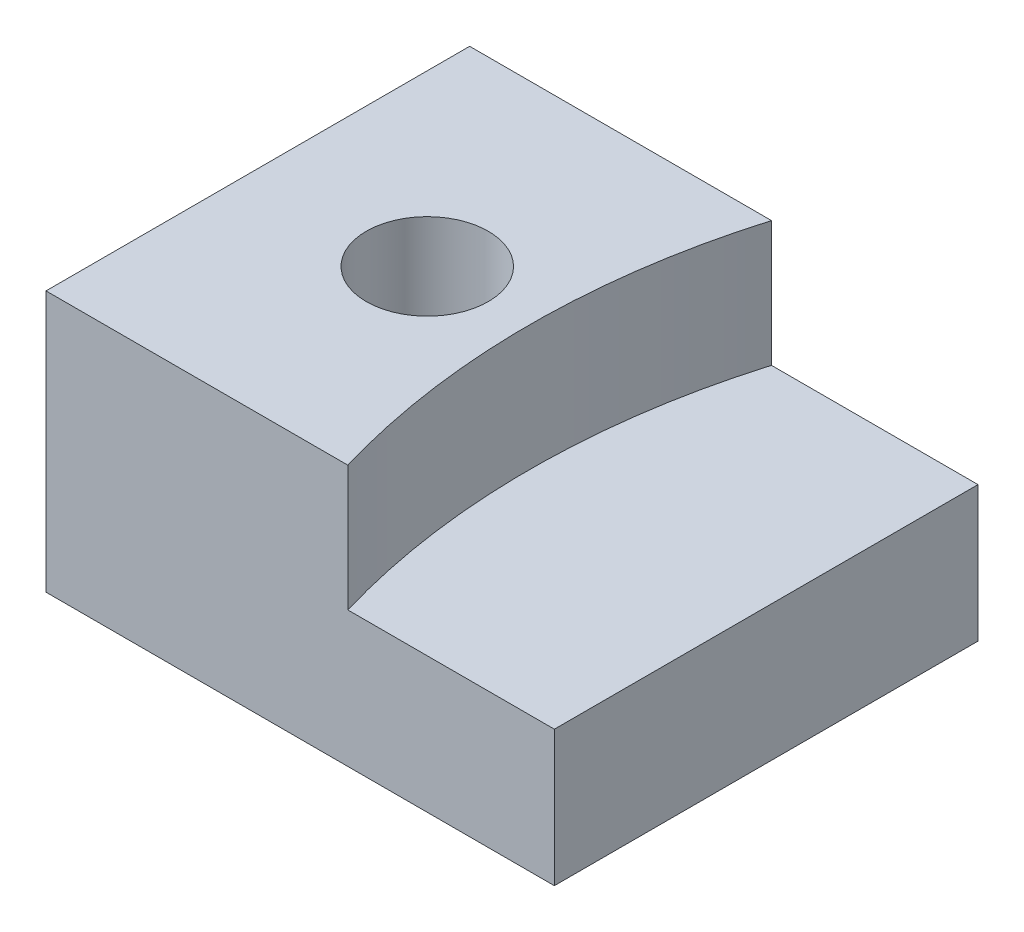
ISO-10303-21;
HEADER;
FILE_DESCRIPTION(('STEP AP214'),'2;1');
FILE_NAME('part.step','',(''),(''),'','','');
FILE_SCHEMA(('AUTOMOTIVE_DESIGN { 1 0 10303 214 1 1 1 1 }'));
ENDSEC;
DATA;
#1=APPLICATION_CONTEXT('core data for automotive mechanical design processes');
#2=APPLICATION_PROTOCOL_DEFINITION('international standard','automotive_design',2000,#1);
#3=PRODUCT_CONTEXT('',#1,'mechanical');
#4=PRODUCT('Part','Part','',(#3));
#5=PRODUCT_RELATED_PRODUCT_CATEGORY('part','',(#4));
#6=PRODUCT_DEFINITION_FORMATION('','',#4);
#7=PRODUCT_DEFINITION_CONTEXT('part definition',#1,'design');
#8=PRODUCT_DEFINITION('design','',#6,#7);
#9=PRODUCT_DEFINITION_SHAPE('','',#8);
#10=(LENGTH_UNIT() NAMED_UNIT(*) SI_UNIT(.MILLI.,.METRE.));
#11=(NAMED_UNIT(*) PLANE_ANGLE_UNIT() SI_UNIT($,.RADIAN.));
#12=(NAMED_UNIT(*) SI_UNIT($,.STERADIAN.) SOLID_ANGLE_UNIT());
#13=UNCERTAINTY_MEASURE_WITH_UNIT(LENGTH_MEASURE(1.E-05),#10,'distance_accuracy_value','');
#14=(GEOMETRIC_REPRESENTATION_CONTEXT(3) GLOBAL_UNCERTAINTY_ASSIGNED_CONTEXT((#13)) GLOBAL_UNIT_ASSIGNED_CONTEXT((#10,
#11,#12)) REPRESENTATION_CONTEXT('',''));
#15=CARTESIAN_POINT('',(0.,0.,0.));
#16=DIRECTION('',(0.,0.,1.));
#17=DIRECTION('',(1.,0.,0.));
#18=AXIS2_PLACEMENT_3D('',#15,#16,#17);
#19=CARTESIAN_POINT('',(0.,2.,0.));
#20=DIRECTION('',(0.,-1.,0.));
#21=DIRECTION('',(0.,0.,-1.));
#22=AXIS2_PLACEMENT_3D('',#19,#20,#21);
#23=PLANE('',#22);
#24=CARTESIAN_POINT('',(12.5,2.,0.));
#25=DIRECTION('',(0.,-1.,0.));
#26=DIRECTION('',(0.,0.,-1.));
#27=AXIS2_PLACEMENT_3D('',#24,#25,#26);
#28=CIRCLE('',#27,11.);
#29=CARTESIAN_POINT('',(1.95322916718108,2.,3.125));
#30=VERTEX_POINT('',#29);
#31=CARTESIAN_POINT('',(1.95322916718107,2.,-3.12499999999999));
#32=VERTEX_POINT('',#31);
#33=EDGE_CURVE('E49',#30,#32,#28,.T.);
#34=ORIENTED_EDGE('',*,*,#33,.F.);
#35=DIRECTION('',(1.,0.,0.));
#36=VECTOR('',#35,1.);
#37=CARTESIAN_POINT('',(-2.5,2.,3.125));
#38=LINE('',#37,#36);
#39=CARTESIAN_POINT('',(5.,2.,3.125));
#40=VERTEX_POINT('',#39);
#41=EDGE_CURVE('E87',#30,#40,#38,.T.);
#42=ORIENTED_EDGE('',*,*,#41,.T.);
#43=DIRECTION('',(0.,0.,-1.));
#44=VECTOR('',#43,1.);
#45=CARTESIAN_POINT('',(5.,2.,3.125));
#46=LINE('',#45,#44);
#47=CARTESIAN_POINT('',(5.,2.,-3.125));
#48=VERTEX_POINT('',#47);
#49=EDGE_CURVE('E55',#40,#48,#46,.T.);
#50=ORIENTED_EDGE('',*,*,#49,.T.);
#51=DIRECTION('',(-1.,0.,0.));
#52=VECTOR('',#51,1.);
#53=CARTESIAN_POINT('',(-2.5,2.,-3.125));
#54=LINE('',#53,#52);
#55=EDGE_CURVE('E97',#48,#32,#54,.T.);
#56=ORIENTED_EDGE('',*,*,#55,.T.);
#57=EDGE_LOOP('',(#34,#42,#50,#56));
#58=FACE_BOUND('',#57,.T.);
#59=ADVANCED_FACE('F34',(#58),#23,.F.);
#60=CARTESIAN_POINT('',(0.,0.,0.));
#61=DIRECTION('',(0.,-1.,0.));
#62=DIRECTION('',(0.,0.,-1.));
#63=AXIS2_PLACEMENT_3D('',#60,#61,#62);
#64=PLANE('',#63);
#65=DIRECTION('',(0.,0.,1.));
#66=VECTOR('',#65,1.);
#67=CARTESIAN_POINT('',(-2.5,0.,3.125));
#68=LINE('',#67,#66);
#69=CARTESIAN_POINT('',(-2.5,0.,-3.125));
#70=VERTEX_POINT('',#69);
#71=CARTESIAN_POINT('',(-2.5,0.,3.125));
#72=VERTEX_POINT('',#71);
#73=EDGE_CURVE('E93',#70,#72,#68,.T.);
#74=ORIENTED_EDGE('',*,*,#73,.F.);
#75=DIRECTION('',(-1.,0.,0.));
#76=VECTOR('',#75,1.);
#77=CARTESIAN_POINT('',(-2.5,0.,-3.125));
#78=LINE('',#77,#76);
#79=CARTESIAN_POINT('',(5.,0.,-3.125));
#80=VERTEX_POINT('',#79);
#81=EDGE_CURVE('E75',#80,#70,#78,.T.);
#82=ORIENTED_EDGE('',*,*,#81,.F.);
#83=DIRECTION('',(0.,0.,-1.));
#84=VECTOR('',#83,1.);
#85=CARTESIAN_POINT('',(5.,0.,3.125));
#86=LINE('',#85,#84);
#87=CARTESIAN_POINT('',(5.,0.,3.125));
#88=VERTEX_POINT('',#87);
#89=EDGE_CURVE('E88',#88,#80,#86,.T.);
#90=ORIENTED_EDGE('',*,*,#89,.F.);
#91=DIRECTION('',(1.,0.,0.));
#92=VECTOR('',#91,1.);
#93=CARTESIAN_POINT('',(-2.5,0.,3.125));
#94=LINE('',#93,#92);
#95=EDGE_CURVE('E101',#72,#88,#94,.T.);
#96=ORIENTED_EDGE('',*,*,#95,.F.);
#97=EDGE_LOOP('',(#74,#82,#90,#96));
#98=FACE_BOUND('',#97,.T.);
#99=CARTESIAN_POINT('',(0.,0.,0.));
#100=DIRECTION('',(0.,1.,0.));
#101=DIRECTION('',(0.,0.,1.));
#102=AXIS2_PLACEMENT_3D('',#99,#100,#101);
#103=CIRCLE('',#102,0.9);
#104=CARTESIAN_POINT('',(0.,0.,0.9));
#105=VERTEX_POINT('',#104);
#106=EDGE_CURVE('E102',#105,#105,#103,.T.);
#107=ORIENTED_EDGE('',*,*,#106,.T.);
#108=EDGE_LOOP('',(#107));
#109=FACE_BOUND('',#108,.T.);
#110=ADVANCED_FACE('F99',(#98,#109),#64,.T.);
#111=CARTESIAN_POINT('',(-2.5,2.,3.125));
#112=DIRECTION('',(1.,0.,0.));
#113=DIRECTION('',(0.,0.,-1.));
#114=AXIS2_PLACEMENT_3D('',#111,#112,#113);
#115=PLANE('',#114);
#116=ORIENTED_EDGE('',*,*,#73,.T.);
#117=DIRECTION('',(0.,-1.,0.));
#118=VECTOR('',#117,1.);
#119=CARTESIAN_POINT('',(-2.5,2.,3.125));
#120=LINE('',#119,#118);
#121=CARTESIAN_POINT('',(-2.5,3.85,3.125));
#122=VERTEX_POINT('',#121);
#123=EDGE_CURVE('E11',#122,#72,#120,.T.);
#124=ORIENTED_EDGE('',*,*,#123,.F.);
#125=DIRECTION('',(0.,0.,1.));
#126=VECTOR('',#125,1.);
#127=CARTESIAN_POINT('',(-2.5,3.85,-3.125));
#128=LINE('',#127,#126);
#129=CARTESIAN_POINT('',(-2.5,3.85,-3.125));
#130=VERTEX_POINT('',#129);
#131=EDGE_CURVE('E95',#130,#122,#128,.T.);
#132=ORIENTED_EDGE('',*,*,#131,.F.);
#133=DIRECTION('',(0.,-1.,0.));
#134=VECTOR('',#133,1.);
#135=CARTESIAN_POINT('',(-2.5,2.,-3.125));
#136=LINE('',#135,#134);
#137=EDGE_CURVE('E80',#130,#70,#136,.T.);
#138=ORIENTED_EDGE('',*,*,#137,.T.);
#139=EDGE_LOOP('',(#116,#124,#132,#138));
#140=FACE_BOUND('',#139,.T.);
#141=ADVANCED_FACE('F36',(#140),#115,.F.);
#142=CARTESIAN_POINT('',(-2.5,2.,3.125));
#143=DIRECTION('',(0.,0.,-1.));
#144=DIRECTION('',(-1.,0.,0.));
#145=AXIS2_PLACEMENT_3D('',#142,#143,#144);
#146=PLANE('',#145);
#147=ORIENTED_EDGE('',*,*,#95,.T.);
#148=DIRECTION('',(0.,-1.,0.));
#149=VECTOR('',#148,1.);
#150=CARTESIAN_POINT('',(5.,2.,3.125));
#151=LINE('',#150,#149);
#152=EDGE_CURVE('E42',#40,#88,#151,.T.);
#153=ORIENTED_EDGE('',*,*,#152,.F.);
#154=ORIENTED_EDGE('',*,*,#41,.F.);
#155=DIRECTION('',(0.,-1.,0.));
#156=VECTOR('',#155,1.);
#157=CARTESIAN_POINT('',(1.95322916718108,3.85,3.125));
#158=LINE('',#157,#156);
#159=CARTESIAN_POINT('',(1.95322916718108,3.85,3.125));
#160=VERTEX_POINT('',#159);
#161=EDGE_CURVE('E106',#160,#30,#158,.T.);
#162=ORIENTED_EDGE('',*,*,#161,.F.);
#163=DIRECTION('',(1.,0.,0.));
#164=VECTOR('',#163,1.);
#165=CARTESIAN_POINT('',(1.95322916718108,3.85,3.125));
#166=LINE('',#165,#164);
#167=EDGE_CURVE('E123',#122,#160,#166,.T.);
#168=ORIENTED_EDGE('',*,*,#167,.F.);
#169=ORIENTED_EDGE('',*,*,#123,.T.);
#170=EDGE_LOOP('',(#147,#153,#154,#162,#168,#169));
#171=FACE_BOUND('',#170,.T.);
#172=ADVANCED_FACE('F117',(#171),#146,.F.);
#173=CARTESIAN_POINT('',(5.,2.,3.125));
#174=DIRECTION('',(-1.,0.,0.));
#175=DIRECTION('',(0.,0.,1.));
#176=AXIS2_PLACEMENT_3D('',#173,#174,#175);
#177=PLANE('',#176);
#178=ORIENTED_EDGE('',*,*,#89,.T.);
#179=DIRECTION('',(0.,-1.,0.));
#180=VECTOR('',#179,1.);
#181=CARTESIAN_POINT('',(5.,2.,-3.125));
#182=LINE('',#181,#180);
#183=EDGE_CURVE('E83',#48,#80,#182,.T.);
#184=ORIENTED_EDGE('',*,*,#183,.F.);
#185=ORIENTED_EDGE('',*,*,#49,.F.);
#186=ORIENTED_EDGE('',*,*,#152,.T.);
#187=EDGE_LOOP('',(#178,#184,#185,#186));
#188=FACE_BOUND('',#187,.T.);
#189=ADVANCED_FACE('F115',(#188),#177,.F.);
#190=CARTESIAN_POINT('',(-2.5,2.,-3.125));
#191=DIRECTION('',(0.,0.,1.));
#192=DIRECTION('',(1.,0.,0.));
#193=AXIS2_PLACEMENT_3D('',#190,#191,#192);
#194=PLANE('',#193);
#195=ORIENTED_EDGE('',*,*,#81,.T.);
#196=ORIENTED_EDGE('',*,*,#137,.F.);
#197=DIRECTION('',(-1.,0.,0.));
#198=VECTOR('',#197,1.);
#199=CARTESIAN_POINT('',(-2.5,3.85,-3.125));
#200=LINE('',#199,#198);
#201=CARTESIAN_POINT('',(1.95322916718107,3.85,-3.12499999999999));
#202=VERTEX_POINT('',#201);
#203=EDGE_CURVE('E130',#202,#130,#200,.T.);
#204=ORIENTED_EDGE('',*,*,#203,.F.);
#205=DIRECTION('',(0.,-1.,0.));
#206=VECTOR('',#205,1.);
#207=CARTESIAN_POINT('',(1.95322916718107,3.85,-3.12499999999999));
#208=LINE('',#207,#206);
#209=EDGE_CURVE('E138',#202,#32,#208,.T.);
#210=ORIENTED_EDGE('',*,*,#209,.T.);
#211=ORIENTED_EDGE('',*,*,#55,.F.);
#212=ORIENTED_EDGE('',*,*,#183,.T.);
#213=EDGE_LOOP('',(#195,#196,#204,#210,#211,#212));
#214=FACE_BOUND('',#213,.T.);
#215=ADVANCED_FACE('F77',(#214),#194,.F.);
#216=CARTESIAN_POINT('',(0.,2.,0.));
#217=DIRECTION('',(0.,-1.,0.));
#218=DIRECTION('',(0.,0.,-1.));
#219=AXIS2_PLACEMENT_3D('',#216,#217,#218);
#220=CYLINDRICAL_SURFACE('',#219,0.9);
#221=ORIENTED_EDGE('',*,*,#106,.F.);
#222=EDGE_LOOP('',(#221));
#223=FACE_BOUND('',#222,.T.);
#224=CARTESIAN_POINT('',(0.,3.85,0.));
#225=DIRECTION('',(0.,1.,0.));
#226=DIRECTION('',(0.,0.,1.));
#227=AXIS2_PLACEMENT_3D('',#224,#225,#226);
#228=CIRCLE('',#227,0.9);
#229=CARTESIAN_POINT('',(0.,3.85,0.9));
#230=VERTEX_POINT('',#229);
#231=EDGE_CURVE('E140',#230,#230,#228,.T.);
#232=ORIENTED_EDGE('',*,*,#231,.T.);
#233=EDGE_LOOP('',(#232));
#234=FACE_BOUND('',#233,.T.);
#235=ADVANCED_FACE('F157',(#223,#234),#220,.F.);
#236=CARTESIAN_POINT('',(12.5,3.85,0.));
#237=DIRECTION('',(0.,-1.,0.));
#238=DIRECTION('',(0.,0.,-1.));
#239=AXIS2_PLACEMENT_3D('',#236,#237,#238);
#240=PLANE('',#239);
#241=ORIENTED_EDGE('',*,*,#203,.T.);
#242=ORIENTED_EDGE('',*,*,#131,.T.);
#243=ORIENTED_EDGE('',*,*,#167,.T.);
#244=CARTESIAN_POINT('',(12.5,3.85,0.));
#245=DIRECTION('',(0.,-1.,0.));
#246=DIRECTION('',(0.,0.,-1.));
#247=AXIS2_PLACEMENT_3D('',#244,#245,#246);
#248=CIRCLE('',#247,11.);
#249=EDGE_CURVE('E132',#160,#202,#248,.T.);
#250=ORIENTED_EDGE('',*,*,#249,.T.);
#251=EDGE_LOOP('',(#241,#242,#243,#250));
#252=FACE_BOUND('',#251,.T.);
#253=ORIENTED_EDGE('',*,*,#231,.F.);
#254=EDGE_LOOP('',(#253));
#255=FACE_BOUND('',#254,.T.);
#256=ADVANCED_FACE('F127',(#252,#255),#240,.F.);
#257=CARTESIAN_POINT('',(12.5,3.85,0.));
#258=DIRECTION('',(0.,-1.,0.));
#259=DIRECTION('',(0.,0.,-1.));
#260=AXIS2_PLACEMENT_3D('',#257,#258,#259);
#261=CYLINDRICAL_SURFACE('',#260,11.);
#262=ORIENTED_EDGE('',*,*,#33,.T.);
#263=ORIENTED_EDGE('',*,*,#209,.F.);
#264=ORIENTED_EDGE('',*,*,#249,.F.);
#265=ORIENTED_EDGE('',*,*,#161,.T.);
#266=EDGE_LOOP('',(#262,#263,#264,#265));
#267=FACE_BOUND('',#266,.T.);
#268=ADVANCED_FACE('F147',(#267),#261,.F.);
#269=CLOSED_SHELL('',(#59,#110,#141,#172,#189,#215,#235,#256,#268));
#270=MANIFOLD_SOLID_BREP('B2',#269);
#271=ADVANCED_BREP_SHAPE_REPRESENTATION('',(#18,#270),#14);
#272=SHAPE_DEFINITION_REPRESENTATION(#9,#271);
ENDSEC;
END-ISO-10303-21;
